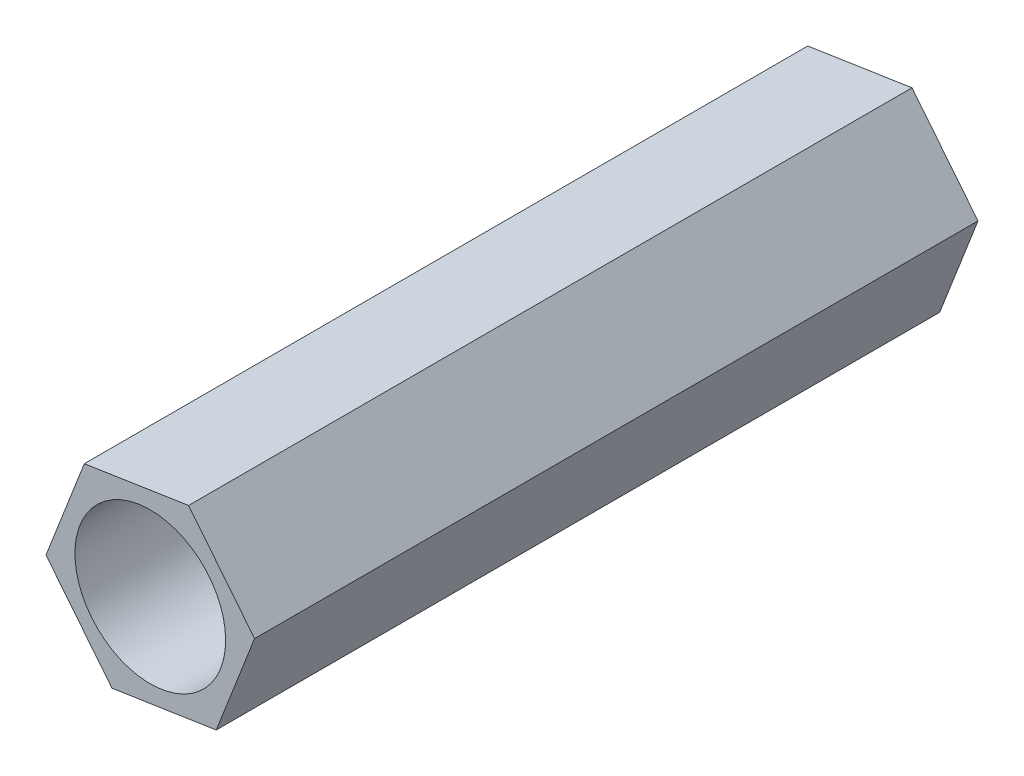
ISO-10303-21;
HEADER;
FILE_DESCRIPTION(('STEP AP214'),'2;1');
FILE_NAME('part.step','',(''),(''),'','','');
FILE_SCHEMA(('AUTOMOTIVE_DESIGN { 1 0 10303 214 1 1 1 1 }'));
ENDSEC;
DATA;
#1=APPLICATION_CONTEXT('core data for automotive mechanical design processes');
#2=APPLICATION_PROTOCOL_DEFINITION('international standard','automotive_design',2000,#1);
#3=PRODUCT_CONTEXT('',#1,'mechanical');
#4=PRODUCT('Part','Part','',(#3));
#5=PRODUCT_RELATED_PRODUCT_CATEGORY('part','',(#4));
#6=PRODUCT_DEFINITION_FORMATION('','',#4);
#7=PRODUCT_DEFINITION_CONTEXT('part definition',#1,'design');
#8=PRODUCT_DEFINITION('design','',#6,#7);
#9=PRODUCT_DEFINITION_SHAPE('','',#8);
#10=(LENGTH_UNIT() NAMED_UNIT(*) SI_UNIT(.MILLI.,.METRE.));
#11=(NAMED_UNIT(*) PLANE_ANGLE_UNIT() SI_UNIT($,.RADIAN.));
#12=(NAMED_UNIT(*) SI_UNIT($,.STERADIAN.) SOLID_ANGLE_UNIT());
#13=UNCERTAINTY_MEASURE_WITH_UNIT(LENGTH_MEASURE(1.E-05),#10,'distance_accuracy_value','');
#14=(GEOMETRIC_REPRESENTATION_CONTEXT(3) GLOBAL_UNCERTAINTY_ASSIGNED_CONTEXT((#13)) GLOBAL_UNIT_ASSIGNED_CONTEXT((#10,
#11,#12)) REPRESENTATION_CONTEXT('',''));
#15=CARTESIAN_POINT('',(0.,0.,0.));
#16=DIRECTION('',(0.,0.,1.));
#17=DIRECTION('',(1.,0.,0.));
#18=AXIS2_PLACEMENT_3D('',#15,#16,#17);
#19=CARTESIAN_POINT('',(0.,0.,12.));
#20=DIRECTION('',(0.,0.,1.));
#21=DIRECTION('',(1.,0.,0.));
#22=AXIS2_PLACEMENT_3D('',#19,#20,#21);
#23=PLANE('',#22);
#24=CARTESIAN_POINT('',(0.,0.,12.));
#25=DIRECTION('',(0.,0.,1.));
#26=DIRECTION('',(1.,0.,0.));
#27=AXIS2_PLACEMENT_3D('',#24,#25,#26);
#28=CIRCLE('',#27,1.25);
#29=CARTESIAN_POINT('',(1.25,0.,12.));
#30=VERTEX_POINT('',#29);
#31=EDGE_CURVE('E12',#30,#30,#28,.T.);
#32=ORIENTED_EDGE('',*,*,#31,.F.);
#33=EDGE_LOOP('',(#32));
#34=FACE_BOUND('',#33,.T.);
#35=DIRECTION('',(-0.363133680946227,-0.931737049688614,0.));
#36=VECTOR('',#35,1.);
#37=CARTESIAN_POINT('',(-1.41208892068563,0.550345237171075,12.));
#38=LINE('',#37,#36);
#39=CARTESIAN_POINT('',(-1.09434694985769,1.36561515564861,12.));
#40=VERTEX_POINT('',#39);
#41=CARTESIAN_POINT('',(-1.72983089151358,-0.264924681306465,12.));
#42=VERTEX_POINT('',#41);
#43=EDGE_CURVE('E149',#40,#42,#38,.T.);
#44=ORIENTED_EDGE('',*,*,#43,.T.);
#45=DIRECTION('',(0.62534111420439,-0.780351517513493,0.));
#46=VECTOR('',#45,1.);
#47=CARTESIAN_POINT('',(-1.18265741658474,-0.947732259130768,12.));
#48=LINE('',#47,#46);
#49=CARTESIAN_POINT('',(-0.635483941655896,-1.63053983695508,12.));
#50=VERTEX_POINT('',#49);
#51=EDGE_CURVE('E129',#42,#50,#48,.T.);
#52=ORIENTED_EDGE('',*,*,#51,.T.);
#53=DIRECTION('',(0.988474795150618,0.151385532175121,0.));
#54=VECTOR('',#53,1.);
#55=CARTESIAN_POINT('',(0.229431504100893,-1.49807749630184,12.));
#56=LINE('',#55,#54);
#57=CARTESIAN_POINT('',(1.09434694985768,-1.36561515564861,12.));
#58=VERTEX_POINT('',#57);
#59=EDGE_CURVE('E173',#50,#58,#56,.T.);
#60=ORIENTED_EDGE('',*,*,#59,.T.);
#61=DIRECTION('',(0.363133680946227,0.931737049688615,0.));
#62=VECTOR('',#61,1.);
#63=CARTESIAN_POINT('',(1.41208892068563,-0.550345237171075,12.));
#64=LINE('',#63,#62);
#65=CARTESIAN_POINT('',(1.72983089151358,0.264924681306464,12.));
#66=VERTEX_POINT('',#65);
#67=EDGE_CURVE('E145',#58,#66,#64,.T.);
#68=ORIENTED_EDGE('',*,*,#67,.T.);
#69=DIRECTION('',(-0.62534111420439,0.780351517513493,0.));
#70=VECTOR('',#69,1.);
#71=CARTESIAN_POINT('',(1.18265741658474,0.947732259130768,12.));
#72=LINE('',#71,#70);
#73=CARTESIAN_POINT('',(0.635483941655895,1.63053983695508,12.));
#74=VERTEX_POINT('',#73);
#75=EDGE_CURVE('E164',#66,#74,#72,.T.);
#76=ORIENTED_EDGE('',*,*,#75,.T.);
#77=DIRECTION('',(-0.988474795150618,-0.151385532175121,0.));
#78=VECTOR('',#77,1.);
#79=CARTESIAN_POINT('',(-0.229431504100893,1.49807749630184,12.));
#80=LINE('',#79,#78);
#81=EDGE_CURVE('E191',#74,#40,#80,.T.);
#82=ORIENTED_EDGE('',*,*,#81,.T.);
#83=EDGE_LOOP('',(#44,#52,#60,#68,#76,#82));
#84=FACE_BOUND('',#83,.T.);
#85=ADVANCED_FACE('F75',(#34,#84),#23,.T.);
#86=CARTESIAN_POINT('',(0.,0.,0.));
#87=DIRECTION('',(0.,0.,1.));
#88=DIRECTION('',(1.,0.,0.));
#89=AXIS2_PLACEMENT_3D('',#86,#87,#88);
#90=PLANE('',#89);
#91=CARTESIAN_POINT('',(0.,0.,0.));
#92=DIRECTION('',(0.,0.,1.));
#93=DIRECTION('',(1.,0.,0.));
#94=AXIS2_PLACEMENT_3D('',#91,#92,#93);
#95=CIRCLE('',#94,1.25);
#96=CARTESIAN_POINT('',(1.25,0.,0.));
#97=VERTEX_POINT('',#96);
#98=EDGE_CURVE('E79',#97,#97,#95,.T.);
#99=ORIENTED_EDGE('',*,*,#98,.T.);
#100=EDGE_LOOP('',(#99));
#101=FACE_BOUND('',#100,.T.);
#102=DIRECTION('',(0.62534111420439,-0.780351517513493,0.));
#103=VECTOR('',#102,1.);
#104=CARTESIAN_POINT('',(-1.18265741658474,-0.947732259130768,0.));
#105=LINE('',#104,#103);
#106=CARTESIAN_POINT('',(-1.72983089151358,-0.264924681306465,0.));
#107=VERTEX_POINT('',#106);
#108=CARTESIAN_POINT('',(-0.635483941655896,-1.63053983695508,0.));
#109=VERTEX_POINT('',#108);
#110=EDGE_CURVE('E126',#107,#109,#105,.T.);
#111=ORIENTED_EDGE('',*,*,#110,.F.);
#112=DIRECTION('',(-0.363133680946227,-0.931737049688614,0.));
#113=VECTOR('',#112,1.);
#114=CARTESIAN_POINT('',(-1.41208892068563,0.550345237171075,0.));
#115=LINE('',#114,#113);
#116=CARTESIAN_POINT('',(-1.09434694985769,1.36561515564861,0.));
#117=VERTEX_POINT('',#116);
#118=EDGE_CURVE('E140',#117,#107,#115,.T.);
#119=ORIENTED_EDGE('',*,*,#118,.F.);
#120=DIRECTION('',(-0.988474795150618,-0.151385532175121,0.));
#121=VECTOR('',#120,1.);
#122=CARTESIAN_POINT('',(-0.229431504100893,1.49807749630184,0.));
#123=LINE('',#122,#121);
#124=CARTESIAN_POINT('',(0.635483941655895,1.63053983695508,0.));
#125=VERTEX_POINT('',#124);
#126=EDGE_CURVE('E93',#125,#117,#123,.T.);
#127=ORIENTED_EDGE('',*,*,#126,.F.);
#128=DIRECTION('',(-0.62534111420439,0.780351517513493,0.));
#129=VECTOR('',#128,1.);
#130=CARTESIAN_POINT('',(1.18265741658474,0.947732259130768,0.));
#131=LINE('',#130,#129);
#132=CARTESIAN_POINT('',(1.72983089151358,0.264924681306464,0.));
#133=VERTEX_POINT('',#132);
#134=EDGE_CURVE('E160',#133,#125,#131,.T.);
#135=ORIENTED_EDGE('',*,*,#134,.F.);
#136=DIRECTION('',(0.363133680946227,0.931737049688615,0.));
#137=VECTOR('',#136,1.);
#138=CARTESIAN_POINT('',(1.41208892068563,-0.550345237171075,0.));
#139=LINE('',#138,#137);
#140=CARTESIAN_POINT('',(1.09434694985768,-1.36561515564861,0.));
#141=VERTEX_POINT('',#140);
#142=EDGE_CURVE('E192',#141,#133,#139,.T.);
#143=ORIENTED_EDGE('',*,*,#142,.F.);
#144=DIRECTION('',(0.988474795150618,0.151385532175121,0.));
#145=VECTOR('',#144,1.);
#146=CARTESIAN_POINT('',(0.229431504100893,-1.49807749630184,0.));
#147=LINE('',#146,#145);
#148=EDGE_CURVE('E143',#109,#141,#147,.T.);
#149=ORIENTED_EDGE('',*,*,#148,.F.);
#150=EDGE_LOOP('',(#111,#119,#127,#135,#143,#149));
#151=FACE_BOUND('',#150,.T.);
#152=ADVANCED_FACE('F77',(#101,#151),#90,.F.);
#153=CARTESIAN_POINT('',(0.,0.,12.));
#154=DIRECTION('',(0.,0.,-1.));
#155=DIRECTION('',(-1.,0.,0.));
#156=AXIS2_PLACEMENT_3D('',#153,#154,#155);
#157=CYLINDRICAL_SURFACE('',#156,1.25);
#158=ORIENTED_EDGE('',*,*,#31,.T.);
#159=EDGE_LOOP('',(#158));
#160=FACE_BOUND('',#159,.T.);
#161=ORIENTED_EDGE('',*,*,#98,.F.);
#162=EDGE_LOOP('',(#161));
#163=FACE_BOUND('',#162,.T.);
#164=ADVANCED_FACE('F223',(#160,#163),#157,.F.);
#165=CARTESIAN_POINT('',(0.229431504100893,-1.49807749630184,0.));
#166=DIRECTION('',(0.151385532175121,-0.988474795150617,0.));
#167=DIRECTION('',(0.988474795150618,0.151385532175121,0.));
#168=AXIS2_PLACEMENT_3D('',#165,#166,#167);
#169=PLANE('',#168);
#170=ORIENTED_EDGE('',*,*,#59,.F.);
#171=DIRECTION('',(0.,0.,1.));
#172=VECTOR('',#171,1.);
#173=CARTESIAN_POINT('',(-0.635483941655896,-1.63053983695508,0.));
#174=LINE('',#173,#172);
#175=EDGE_CURVE('E168',#109,#50,#174,.T.);
#176=ORIENTED_EDGE('',*,*,#175,.F.);
#177=ORIENTED_EDGE('',*,*,#148,.T.);
#178=DIRECTION('',(0.,0.,1.));
#179=VECTOR('',#178,1.);
#180=CARTESIAN_POINT('',(1.09434694985768,-1.36561515564861,0.));
#181=LINE('',#180,#179);
#182=EDGE_CURVE('E187',#141,#58,#181,.T.);
#183=ORIENTED_EDGE('',*,*,#182,.T.);
#184=EDGE_LOOP('',(#170,#176,#177,#183));
#185=FACE_BOUND('',#184,.T.);
#186=ADVANCED_FACE('F186',(#185),#169,.T.);
#187=CARTESIAN_POINT('',(1.18265741658474,0.947732259130768,0.));
#188=DIRECTION('',(0.780351517513493,0.62534111420439,0.));
#189=DIRECTION('',(-0.62534111420439,0.780351517513493,0.));
#190=AXIS2_PLACEMENT_3D('',#187,#188,#189);
#191=PLANE('',#190);
#192=ORIENTED_EDGE('',*,*,#75,.F.);
#193=DIRECTION('',(0.,0.,1.));
#194=VECTOR('',#193,1.);
#195=CARTESIAN_POINT('',(1.72983089151358,0.264924681306464,0.));
#196=LINE('',#195,#194);
#197=EDGE_CURVE('E154',#133,#66,#196,.T.);
#198=ORIENTED_EDGE('',*,*,#197,.F.);
#199=ORIENTED_EDGE('',*,*,#134,.T.);
#200=DIRECTION('',(0.,0.,1.));
#201=VECTOR('',#200,1.);
#202=CARTESIAN_POINT('',(0.635483941655895,1.63053983695508,0.));
#203=LINE('',#202,#201);
#204=EDGE_CURVE('E157',#125,#74,#203,.T.);
#205=ORIENTED_EDGE('',*,*,#204,.T.);
#206=EDGE_LOOP('',(#192,#198,#199,#205));
#207=FACE_BOUND('',#206,.T.);
#208=ADVANCED_FACE('F204',(#207),#191,.T.);
#209=CARTESIAN_POINT('',(-1.41208892068563,0.550345237171075,0.));
#210=DIRECTION('',(-0.931737049688614,0.363133680946227,0.));
#211=DIRECTION('',(-0.363133680946227,-0.931737049688614,0.));
#212=AXIS2_PLACEMENT_3D('',#209,#210,#211);
#213=PLANE('',#212);
#214=ORIENTED_EDGE('',*,*,#43,.F.);
#215=DIRECTION('',(0.,0.,1.));
#216=VECTOR('',#215,1.);
#217=CARTESIAN_POINT('',(-1.09434694985769,1.36561515564861,0.));
#218=LINE('',#217,#216);
#219=EDGE_CURVE('E135',#117,#40,#218,.T.);
#220=ORIENTED_EDGE('',*,*,#219,.F.);
#221=ORIENTED_EDGE('',*,*,#118,.T.);
#222=DIRECTION('',(0.,0.,1.));
#223=VECTOR('',#222,1.);
#224=CARTESIAN_POINT('',(-1.72983089151358,-0.264924681306465,0.));
#225=LINE('',#224,#223);
#226=EDGE_CURVE('E123',#107,#42,#225,.T.);
#227=ORIENTED_EDGE('',*,*,#226,.T.);
#228=EDGE_LOOP('',(#214,#220,#221,#227));
#229=FACE_BOUND('',#228,.T.);
#230=ADVANCED_FACE('F147',(#229),#213,.T.);
#231=CARTESIAN_POINT('',(-0.229431504100893,1.49807749630184,0.));
#232=DIRECTION('',(-0.151385532175121,0.988474795150617,0.));
#233=DIRECTION('',(-0.988474795150618,-0.151385532175121,0.));
#234=AXIS2_PLACEMENT_3D('',#231,#232,#233);
#235=PLANE('',#234);
#236=ORIENTED_EDGE('',*,*,#81,.F.);
#237=ORIENTED_EDGE('',*,*,#204,.F.);
#238=ORIENTED_EDGE('',*,*,#126,.T.);
#239=ORIENTED_EDGE('',*,*,#219,.T.);
#240=EDGE_LOOP('',(#236,#237,#238,#239));
#241=FACE_BOUND('',#240,.T.);
#242=ADVANCED_FACE('F210',(#241),#235,.T.);
#243=CARTESIAN_POINT('',(1.41208892068563,-0.550345237171075,0.));
#244=DIRECTION('',(0.931737049688614,-0.363133680946227,0.));
#245=DIRECTION('',(0.363133680946227,0.931737049688615,0.));
#246=AXIS2_PLACEMENT_3D('',#243,#244,#245);
#247=PLANE('',#246);
#248=ORIENTED_EDGE('',*,*,#67,.F.);
#249=ORIENTED_EDGE('',*,*,#182,.F.);
#250=ORIENTED_EDGE('',*,*,#142,.T.);
#251=ORIENTED_EDGE('',*,*,#197,.T.);
#252=EDGE_LOOP('',(#248,#249,#250,#251));
#253=FACE_BOUND('',#252,.T.);
#254=ADVANCED_FACE('F208',(#253),#247,.T.);
#255=CARTESIAN_POINT('',(-1.18265741658474,-0.947732259130768,0.));
#256=DIRECTION('',(-0.780351517513493,-0.62534111420439,0.));
#257=DIRECTION('',(0.62534111420439,-0.780351517513493,0.));
#258=AXIS2_PLACEMENT_3D('',#255,#256,#257);
#259=PLANE('',#258);
#260=ORIENTED_EDGE('',*,*,#51,.F.);
#261=ORIENTED_EDGE('',*,*,#226,.F.);
#262=ORIENTED_EDGE('',*,*,#110,.T.);
#263=ORIENTED_EDGE('',*,*,#175,.T.);
#264=EDGE_LOOP('',(#260,#261,#262,#263));
#265=FACE_BOUND('',#264,.T.);
#266=ADVANCED_FACE('F125',(#265),#259,.T.);
#267=CLOSED_SHELL('',(#85,#152,#164,#186,#208,#230,#242,#254,#266));
#268=MANIFOLD_SOLID_BREP('B2',#267);
#269=ADVANCED_BREP_SHAPE_REPRESENTATION('',(#18,#268),#14);
#270=SHAPE_DEFINITION_REPRESENTATION(#9,#269);
ENDSEC;
END-ISO-10303-21;
